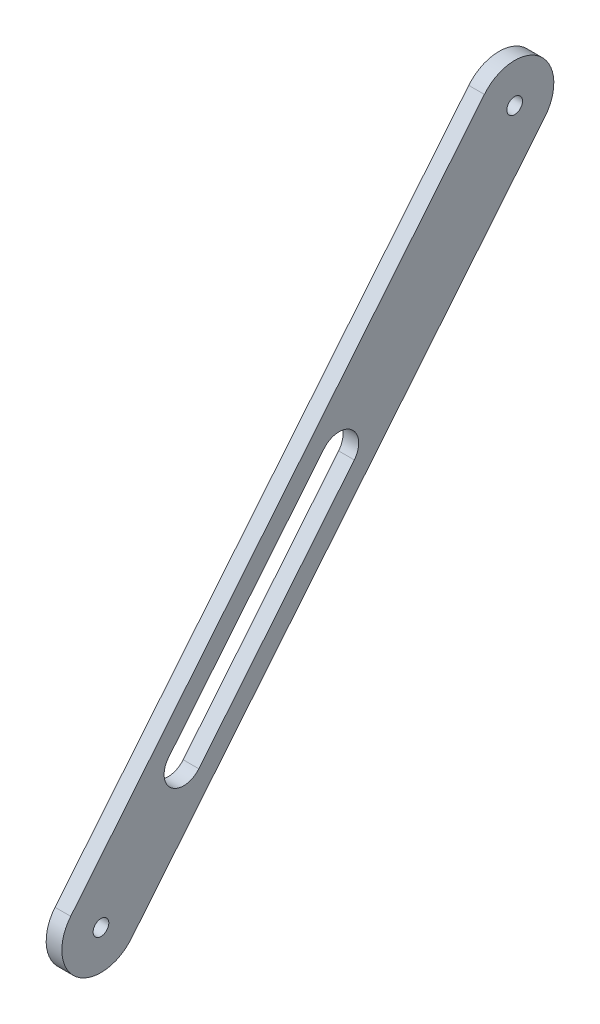
ISO-10303-21;
HEADER;
FILE_DESCRIPTION(('STEP AP214'),'2;1');
FILE_NAME('part.step','',(''),(''),'','','');
FILE_SCHEMA(('AUTOMOTIVE_DESIGN { 1 0 10303 214 1 1 1 1 }'));
ENDSEC;
DATA;
#1=APPLICATION_CONTEXT('core data for automotive mechanical design processes');
#2=APPLICATION_PROTOCOL_DEFINITION('international standard','automotive_design',2000,#1);
#3=PRODUCT_CONTEXT('',#1,'mechanical');
#4=PRODUCT('Part','Part','',(#3));
#5=PRODUCT_RELATED_PRODUCT_CATEGORY('part','',(#4));
#6=PRODUCT_DEFINITION_FORMATION('','',#4);
#7=PRODUCT_DEFINITION_CONTEXT('part definition',#1,'design');
#8=PRODUCT_DEFINITION('design','',#6,#7);
#9=PRODUCT_DEFINITION_SHAPE('','',#8);
#10=(LENGTH_UNIT() NAMED_UNIT(*) SI_UNIT(.MILLI.,.METRE.));
#11=(NAMED_UNIT(*) PLANE_ANGLE_UNIT() SI_UNIT($,.RADIAN.));
#12=(NAMED_UNIT(*) SI_UNIT($,.STERADIAN.) SOLID_ANGLE_UNIT());
#13=UNCERTAINTY_MEASURE_WITH_UNIT(LENGTH_MEASURE(1.E-05),#10,'distance_accuracy_value','');
#14=(GEOMETRIC_REPRESENTATION_CONTEXT(3) GLOBAL_UNCERTAINTY_ASSIGNED_CONTEXT((#13)) GLOBAL_UNIT_ASSIGNED_CONTEXT((#10,
#11,#12)) REPRESENTATION_CONTEXT('',''));
#15=CARTESIAN_POINT('',(0.,0.,0.));
#16=DIRECTION('',(0.,0.,1.));
#17=DIRECTION('',(1.,0.,0.));
#18=AXIS2_PLACEMENT_3D('',#15,#16,#17);
#19=CARTESIAN_POINT('',(-3.99999999999867,21949.5715431067,-17815.443941645));
#20=DIRECTION('',(0.,-0.633762743813113,-0.773527494375264));
#21=DIRECTION('',(0.,0.773527494375265,-0.633762743813113));
#22=AXIS2_PLACEMENT_3D('',#19,#20,#21);
#23=PLANE('',#22);
#24=DIRECTION('',(0.,-0.773527494375265,0.633762743813113));
#25=VECTOR('',#24,1.);
#26=CARTESIAN_POINT('',(-6.99999999999867,21949.5715431067,-17815.443941645));
#27=LINE('',#26,#25);
#28=CARTESIAN_POINT('',(-7.00000000000001,107.394735413521,80.1809781579693));
#29=VERTEX_POINT('',#28);
#30=CARTESIAN_POINT('',(-7.00000000000001,10.6467794213656,159.448037821336));
#31=VERTEX_POINT('',#30);
#32=EDGE_CURVE('E134',#29,#31,#27,.T.);
#33=ORIENTED_EDGE('',*,*,#32,.F.);
#34=DIRECTION('',(-1.,0.,0.));
#35=VECTOR('',#34,1.);
#36=CARTESIAN_POINT('',(-4.00000000000001,107.394735413521,80.1809781579693));
#37=LINE('',#36,#35);
#38=CARTESIAN_POINT('',(-4.00000000000001,107.394735413521,80.1809781579693));
#39=VERTEX_POINT('',#38);
#40=EDGE_CURVE('E11',#39,#29,#37,.T.);
#41=ORIENTED_EDGE('',*,*,#40,.F.);
#42=DIRECTION('',(0.,-0.773527494375265,0.633762743813113));
#43=VECTOR('',#42,1.);
#44=CARTESIAN_POINT('',(-3.99999999999867,21949.5715431067,-17815.443941645));
#45=LINE('',#44,#43);
#46=CARTESIAN_POINT('',(-4.00000000000001,10.6467794213656,159.448037821336));
#47=VERTEX_POINT('',#46);
#48=EDGE_CURVE('E138',#39,#47,#45,.T.);
#49=ORIENTED_EDGE('',*,*,#48,.T.);
#50=DIRECTION('',(-1.,0.,0.));
#51=VECTOR('',#50,1.);
#52=CARTESIAN_POINT('',(-4.00000000000001,10.6467794213656,159.448037821336));
#53=LINE('',#52,#51);
#54=EDGE_CURVE('E151',#47,#31,#53,.T.);
#55=ORIENTED_EDGE('',*,*,#54,.T.);
#56=EDGE_LOOP('',(#33,#41,#49,#55));
#57=FACE_BOUND('',#56,.T.);
#58=ADVANCED_FACE('F33',(#57),#23,.T.);
#59=CARTESIAN_POINT('',(-4.00000000000001,112.147955992155,85.9824343657549));
#60=DIRECTION('',(-1.,0.,0.));
#61=DIRECTION('',(0.,0.,1.));
#62=AXIS2_PLACEMENT_3D('',#59,#60,#61);
#63=CYLINDRICAL_SURFACE('',#62,7.49999999999999);
#64=CARTESIAN_POINT('',(-7.00000000000001,112.147955992155,85.9824343657549));
#65=DIRECTION('',(-1.,0.,0.));
#66=DIRECTION('',(0.,0.,1.));
#67=AXIS2_PLACEMENT_3D('',#64,#65,#66);
#68=CIRCLE('',#67,7.49999999999999);
#69=CARTESIAN_POINT('',(-7.00000000000001,116.901176570709,91.7838905736058));
#70=VERTEX_POINT('',#69);
#71=EDGE_CURVE('E142',#70,#29,#68,.T.);
#72=ORIENTED_EDGE('',*,*,#71,.F.);
#73=DIRECTION('',(-1.,0.,0.));
#74=VECTOR('',#73,1.);
#75=CARTESIAN_POINT('',(-4.00000000000001,116.901176570709,91.7838905736058));
#76=LINE('',#75,#74);
#77=CARTESIAN_POINT('',(-4.00000000000001,116.901176570709,91.7838905736058));
#78=VERTEX_POINT('',#77);
#79=EDGE_CURVE('E41',#78,#70,#76,.T.);
#80=ORIENTED_EDGE('',*,*,#79,.F.);
#81=CARTESIAN_POINT('',(-4.00000000000001,112.147955992155,85.9824343657549));
#82=DIRECTION('',(-1.,0.,0.));
#83=DIRECTION('',(0.,0.,1.));
#84=AXIS2_PLACEMENT_3D('',#81,#82,#83);
#85=CIRCLE('',#84,7.49999999999999);
#86=EDGE_CURVE('E148',#78,#39,#85,.T.);
#87=ORIENTED_EDGE('',*,*,#86,.T.);
#88=ORIENTED_EDGE('',*,*,#40,.T.);
#89=EDGE_LOOP('',(#72,#80,#87,#88));
#90=FACE_BOUND('',#89,.T.);
#91=ADVANCED_FACE('F176',(#90),#63,.T.);
#92=CARTESIAN_POINT('',(-3.99999999999867,21959.077984264,-17803.8410292294));
#93=DIRECTION('',(0.,0.633762743813113,0.773527494375264));
#94=DIRECTION('',(0.,-0.773527494375264,0.633762743813113));
#95=AXIS2_PLACEMENT_3D('',#92,#93,#94);
#96=PLANE('',#95);
#97=DIRECTION('',(0.,0.773527494375264,-0.633762743813113));
#98=VECTOR('',#97,1.);
#99=CARTESIAN_POINT('',(-6.99999999999867,21959.077984264,-17803.8410292294));
#100=LINE('',#99,#98);
#101=CARTESIAN_POINT('',(-7.00000000000001,20.1532205786314,171.050950236992));
#102=VERTEX_POINT('',#101);
#103=EDGE_CURVE('E157',#102,#70,#100,.T.);
#104=ORIENTED_EDGE('',*,*,#103,.F.);
#105=DIRECTION('',(-1.,0.,0.));
#106=VECTOR('',#105,1.);
#107=CARTESIAN_POINT('',(-4.00000000000001,20.1532205786314,171.050950236992));
#108=LINE('',#107,#106);
#109=CARTESIAN_POINT('',(-4.00000000000001,20.1532205786314,171.050950236992));
#110=VERTEX_POINT('',#109);
#111=EDGE_CURVE('E163',#110,#102,#108,.T.);
#112=ORIENTED_EDGE('',*,*,#111,.F.);
#113=DIRECTION('',(0.,0.773527494375264,-0.633762743813113));
#114=VECTOR('',#113,1.);
#115=CARTESIAN_POINT('',(-3.99999999999867,21959.077984264,-17803.8410292294));
#116=LINE('',#115,#114);
#117=EDGE_CURVE('E145',#110,#78,#116,.T.);
#118=ORIENTED_EDGE('',*,*,#117,.T.);
#119=ORIENTED_EDGE('',*,*,#79,.T.);
#120=EDGE_LOOP('',(#104,#112,#118,#119));
#121=FACE_BOUND('',#120,.T.);
#122=ADVANCED_FACE('F180',(#121),#96,.T.);
#123=CARTESIAN_POINT('',(-4.00000000000001,15.4,165.249494029121));
#124=DIRECTION('',(-1.,0.,0.));
#125=DIRECTION('',(0.,0.,1.));
#126=AXIS2_PLACEMENT_3D('',#123,#124,#125);
#127=CYLINDRICAL_SURFACE('',#126,7.50000000000002);
#128=CARTESIAN_POINT('',(-7.00000000000001,15.4,165.249494029121));
#129=DIRECTION('',(-1.,0.,0.));
#130=DIRECTION('',(0.,0.,1.));
#131=AXIS2_PLACEMENT_3D('',#128,#129,#130);
#132=CIRCLE('',#131,7.50000000000002);
#133=EDGE_CURVE('E154',#31,#102,#132,.T.);
#134=ORIENTED_EDGE('',*,*,#133,.F.);
#135=ORIENTED_EDGE('',*,*,#54,.F.);
#136=CARTESIAN_POINT('',(-4.00000000000001,15.4,165.249494029121));
#137=DIRECTION('',(-1.,0.,0.));
#138=DIRECTION('',(0.,0.,1.));
#139=AXIS2_PLACEMENT_3D('',#136,#137,#138);
#140=CIRCLE('',#139,7.50000000000002);
#141=EDGE_CURVE('E141',#47,#110,#140,.T.);
#142=ORIENTED_EDGE('',*,*,#141,.T.);
#143=ORIENTED_EDGE('',*,*,#111,.T.);
#144=EDGE_LOOP('',(#134,#135,#142,#143));
#145=FACE_BOUND('',#144,.T.);
#146=ADVANCED_FACE('F170',(#145),#127,.T.);
#147=CARTESIAN_POINT('',(-4.00000000000001,15.4,165.249494029121));
#148=DIRECTION('',(-1.,0.,0.));
#149=DIRECTION('',(0.,0.,1.));
#150=AXIS2_PLACEMENT_3D('',#147,#148,#149);
#151=PLANE('',#150);
#152=CARTESIAN_POINT('',(-4.00000000000001,112.147955992155,85.9824343657549));
#153=DIRECTION('',(-1.,0.,0.));
#154=DIRECTION('',(0.,0.,1.));
#155=AXIS2_PLACEMENT_3D('',#152,#153,#154);
#156=CIRCLE('',#155,1.49999999999999);
#157=CARTESIAN_POINT('',(-4.00000000000001,112.147955992155,87.4824343657549));
#158=VERTEX_POINT('',#157);
#159=EDGE_CURVE('E36',#158,#158,#156,.T.);
#160=ORIENTED_EDGE('',*,*,#159,.T.);
#161=EDGE_LOOP('',(#160));
#162=FACE_BOUND('',#161,.T.);
#163=CARTESIAN_POINT('',(-4.00000000000001,15.4,165.249494029121));
#164=DIRECTION('',(-1.,0.,0.));
#165=DIRECTION('',(0.,0.,1.));
#166=AXIS2_PLACEMENT_3D('',#163,#164,#165);
#167=CIRCLE('',#166,1.49999999999999);
#168=CARTESIAN_POINT('',(-4.00000000000001,15.4,166.749494029121));
#169=VERTEX_POINT('',#168);
#170=EDGE_CURVE('E122',#169,#169,#167,.T.);
#171=ORIENTED_EDGE('',*,*,#170,.T.);
#172=EDGE_LOOP('',(#171));
#173=FACE_BOUND('',#172,.T.);
#174=CARTESIAN_POINT('',(-4.00000000000001,71.093979595019,119.618576474577));
#175=DIRECTION('',(-1.,0.,0.));
#176=DIRECTION('',(0.,0.,1.));
#177=AXIS2_PLACEMENT_3D('',#174,#175,#176);
#178=CIRCLE('',#177,3.75000000000029);
#179=CARTESIAN_POINT('',(-4.00000000000001,73.470589884327,122.519304578478));
#180=VERTEX_POINT('',#179);
#181=CARTESIAN_POINT('',(-4.00000000000001,68.717369305683,116.7178483707));
#182=VERTEX_POINT('',#181);
#183=EDGE_CURVE('E106',#180,#182,#178,.T.);
#184=ORIENTED_EDGE('',*,*,#183,.T.);
#185=DIRECTION('',(0.,-0.773527494375264,0.633762743813113));
#186=VECTOR('',#185,1.);
#187=CARTESIAN_POINT('',(-3.99999999999867,21951.9481533962,-17812.5432135413));
#188=LINE('',#187,#186);
#189=CARTESIAN_POINT('',(-4.00000000000001,32.3615770700471,146.504697329915));
#190=VERTEX_POINT('',#189);
#191=EDGE_CURVE('E100',#182,#190,#188,.T.);
#192=ORIENTED_EDGE('',*,*,#191,.T.);
#193=CARTESIAN_POINT('',(-4.00000000000001,34.7381873593816,149.405425433794));
#194=DIRECTION('',(-1.,0.,0.));
#195=DIRECTION('',(0.,0.,1.));
#196=AXIS2_PLACEMENT_3D('',#193,#194,#195);
#197=CIRCLE('',#196,3.75000000000032);
#198=CARTESIAN_POINT('',(-4.00000000000001,37.1147976486773,152.306153537704));
#199=VERTEX_POINT('',#198);
#200=EDGE_CURVE('E109',#190,#199,#197,.T.);
#201=ORIENTED_EDGE('',*,*,#200,.T.);
#202=DIRECTION('',(0.,0.773527494375264,-0.633762743813114));
#203=VECTOR('',#202,1.);
#204=CARTESIAN_POINT('',(-3.99999999999867,21956.7013739751,-17806.7417573338));
#205=LINE('',#204,#203);
#206=EDGE_CURVE('E49',#199,#180,#205,.T.);
#207=ORIENTED_EDGE('',*,*,#206,.T.);
#208=EDGE_LOOP('',(#184,#192,#201,#207));
#209=FACE_BOUND('',#208,.T.);
#210=ORIENTED_EDGE('',*,*,#48,.F.);
#211=ORIENTED_EDGE('',*,*,#86,.F.);
#212=ORIENTED_EDGE('',*,*,#117,.F.);
#213=ORIENTED_EDGE('',*,*,#141,.F.);
#214=EDGE_LOOP('',(#210,#211,#212,#213));
#215=FACE_BOUND('',#214,.T.);
#216=ADVANCED_FACE('F113',(#162,#173,#209,#215),#151,.F.);
#217=CARTESIAN_POINT('',(-7.00000000000001,15.4,165.249494029121));
#218=DIRECTION('',(-1.,0.,0.));
#219=DIRECTION('',(0.,0.,1.));
#220=AXIS2_PLACEMENT_3D('',#217,#218,#219);
#221=PLANE('',#220);
#222=CARTESIAN_POINT('',(-7.00000000000001,112.147955992155,85.9824343657549));
#223=DIRECTION('',(1.,0.,0.));
#224=DIRECTION('',(0.,0.,-1.));
#225=AXIS2_PLACEMENT_3D('',#222,#223,#224);
#226=CIRCLE('',#225,1.5);
#227=CARTESIAN_POINT('',(-7.00000000000001,112.147955992155,84.4824343657549));
#228=VERTEX_POINT('',#227);
#229=EDGE_CURVE('E285',#228,#228,#226,.T.);
#230=ORIENTED_EDGE('',*,*,#229,.T.);
#231=EDGE_LOOP('',(#230));
#232=FACE_BOUND('',#231,.T.);
#233=CARTESIAN_POINT('',(-7.00000000000002,15.4,165.249494029121));
#234=DIRECTION('',(1.,0.,0.));
#235=DIRECTION('',(0.,0.,-1.));
#236=AXIS2_PLACEMENT_3D('',#233,#234,#235);
#237=CIRCLE('',#236,1.5);
#238=CARTESIAN_POINT('',(-7.00000000000002,15.4,163.749494029121));
#239=VERTEX_POINT('',#238);
#240=EDGE_CURVE('E288',#239,#239,#237,.T.);
#241=ORIENTED_EDGE('',*,*,#240,.T.);
#242=EDGE_LOOP('',(#241));
#243=FACE_BOUND('',#242,.T.);
#244=DIRECTION('',(0.,-0.773527494375264,0.633762743813113));
#245=VECTOR('',#244,1.);
#246=CARTESIAN_POINT('',(-6.99999999999867,21951.9481533962,-17812.5432135413));
#247=LINE('',#246,#245);
#248=CARTESIAN_POINT('',(-7.00000000000001,68.717369305683,116.7178483707));
#249=VERTEX_POINT('',#248);
#250=CARTESIAN_POINT('',(-7.00000000000001,32.3615770700471,146.504697329915));
#251=VERTEX_POINT('',#250);
#252=EDGE_CURVE('E57',#249,#251,#247,.T.);
#253=ORIENTED_EDGE('',*,*,#252,.F.);
#254=CARTESIAN_POINT('',(-7.00000000000001,71.093979595019,119.618576474577));
#255=DIRECTION('',(-1.,0.,0.));
#256=DIRECTION('',(0.,0.,1.));
#257=AXIS2_PLACEMENT_3D('',#254,#255,#256);
#258=CIRCLE('',#257,3.75000000000029);
#259=CARTESIAN_POINT('',(-7.00000000000001,73.470589884327,122.519304578478));
#260=VERTEX_POINT('',#259);
#261=EDGE_CURVE('E116',#260,#249,#258,.T.);
#262=ORIENTED_EDGE('',*,*,#261,.F.);
#263=DIRECTION('',(0.,0.773527494375264,-0.633762743813114));
#264=VECTOR('',#263,1.);
#265=CARTESIAN_POINT('',(-6.99999999999867,21956.7013739751,-17806.7417573338));
#266=LINE('',#265,#264);
#267=CARTESIAN_POINT('',(-7.00000000000001,37.1147976486661,152.30615353769));
#268=VERTEX_POINT('',#267);
#269=EDGE_CURVE('E119',#268,#260,#266,.T.);
#270=ORIENTED_EDGE('',*,*,#269,.F.);
#271=CARTESIAN_POINT('',(-7.00000000000001,34.7381873593816,149.405425433794));
#272=DIRECTION('',(-1.,0.,0.));
#273=DIRECTION('',(0.,0.,1.));
#274=AXIS2_PLACEMENT_3D('',#271,#272,#273);
#275=CIRCLE('',#274,3.75000000000032);
#276=EDGE_CURVE('E128',#251,#268,#275,.T.);
#277=ORIENTED_EDGE('',*,*,#276,.F.);
#278=EDGE_LOOP('',(#253,#262,#270,#277));
#279=FACE_BOUND('',#278,.T.);
#280=ORIENTED_EDGE('',*,*,#32,.T.);
#281=ORIENTED_EDGE('',*,*,#133,.T.);
#282=ORIENTED_EDGE('',*,*,#103,.T.);
#283=ORIENTED_EDGE('',*,*,#71,.T.);
#284=EDGE_LOOP('',(#280,#281,#282,#283));
#285=FACE_BOUND('',#284,.T.);
#286=ADVANCED_FACE('F173',(#232,#243,#279,#285),#221,.T.);
#287=CARTESIAN_POINT('',(-3.99999999999867,21951.9481533962,-17812.5432135413));
#288=DIRECTION('',(0.,-0.633762743813113,-0.773527494375264));
#289=DIRECTION('',(0.,0.773527494375264,-0.633762743813113));
#290=AXIS2_PLACEMENT_3D('',#287,#288,#289);
#291=PLANE('',#290);
#292=ORIENTED_EDGE('',*,*,#252,.T.);
#293=DIRECTION('',(-1.,0.,0.));
#294=VECTOR('',#293,1.);
#295=CARTESIAN_POINT('',(-4.00000000000001,32.3615770700471,146.504697329915));
#296=LINE('',#295,#294);
#297=EDGE_CURVE('E96',#190,#251,#296,.T.);
#298=ORIENTED_EDGE('',*,*,#297,.F.);
#299=ORIENTED_EDGE('',*,*,#191,.F.);
#300=DIRECTION('',(-1.,0.,0.));
#301=VECTOR('',#300,1.);
#302=CARTESIAN_POINT('',(-4.00000000000001,68.717369305683,116.7178483707));
#303=LINE('',#302,#301);
#304=EDGE_CURVE('E132',#182,#249,#303,.T.);
#305=ORIENTED_EDGE('',*,*,#304,.T.);
#306=EDGE_LOOP('',(#292,#298,#299,#305));
#307=FACE_BOUND('',#306,.T.);
#308=ADVANCED_FACE('F98',(#307),#291,.F.);
#309=CARTESIAN_POINT('',(-4.00000000000001,71.093979595019,119.618576474577));
#310=DIRECTION('',(-1.,0.,0.));
#311=DIRECTION('',(0.,0.,1.));
#312=AXIS2_PLACEMENT_3D('',#309,#310,#311);
#313=CYLINDRICAL_SURFACE('',#312,3.75000000000029);
#314=ORIENTED_EDGE('',*,*,#261,.T.);
#315=ORIENTED_EDGE('',*,*,#304,.F.);
#316=ORIENTED_EDGE('',*,*,#183,.F.);
#317=DIRECTION('',(-1.,0.,0.));
#318=VECTOR('',#317,1.);
#319=CARTESIAN_POINT('',(-4.00000000000001,73.470589884327,122.519304578478));
#320=LINE('',#319,#318);
#321=EDGE_CURVE('E135',#180,#260,#320,.T.);
#322=ORIENTED_EDGE('',*,*,#321,.T.);
#323=EDGE_LOOP('',(#314,#315,#316,#322));
#324=FACE_BOUND('',#323,.T.);
#325=ADVANCED_FACE('F216',(#324),#313,.F.);
#326=CARTESIAN_POINT('',(-3.99999999999867,21956.7013739751,-17806.7417573338));
#327=DIRECTION('',(0.,0.633762743813114,0.773527494375263));
#328=DIRECTION('',(0.,-0.773527494375263,0.633762743813114));
#329=AXIS2_PLACEMENT_3D('',#326,#327,#328);
#330=PLANE('',#329);
#331=ORIENTED_EDGE('',*,*,#269,.T.);
#332=ORIENTED_EDGE('',*,*,#321,.F.);
#333=ORIENTED_EDGE('',*,*,#206,.F.);
#334=DIRECTION('',(-1.,0.,0.));
#335=VECTOR('',#334,1.);
#336=CARTESIAN_POINT('',(-4.00000000000001,37.1147976486661,152.30615353769));
#337=LINE('',#336,#335);
#338=EDGE_CURVE('E105',#199,#268,#337,.T.);
#339=ORIENTED_EDGE('',*,*,#338,.T.);
#340=EDGE_LOOP('',(#331,#332,#333,#339));
#341=FACE_BOUND('',#340,.T.);
#342=ADVANCED_FACE('F227',(#341),#330,.F.);
#343=CARTESIAN_POINT('',(-4.00000000000001,34.7381873593816,149.405425433794));
#344=DIRECTION('',(-1.,0.,0.));
#345=DIRECTION('',(0.,0.,1.));
#346=AXIS2_PLACEMENT_3D('',#343,#344,#345);
#347=CYLINDRICAL_SURFACE('',#346,3.75000000000032);
#348=ORIENTED_EDGE('',*,*,#276,.T.);
#349=ORIENTED_EDGE('',*,*,#338,.F.);
#350=ORIENTED_EDGE('',*,*,#200,.F.);
#351=ORIENTED_EDGE('',*,*,#297,.T.);
#352=EDGE_LOOP('',(#348,#349,#350,#351));
#353=FACE_BOUND('',#352,.T.);
#354=ADVANCED_FACE('F110',(#353),#347,.F.);
#355=CARTESIAN_POINT('',(0.,15.4,165.249494029121));
#356=DIRECTION('',(1.,0.,0.));
#357=DIRECTION('',(0.,0.,-1.));
#358=AXIS2_PLACEMENT_3D('',#355,#356,#357);
#359=CYLINDRICAL_SURFACE('',#358,1.49999999999999);
#360=ORIENTED_EDGE('',*,*,#240,.F.);
#361=EDGE_LOOP('',(#360));
#362=FACE_BOUND('',#361,.T.);
#363=ORIENTED_EDGE('',*,*,#170,.F.);
#364=EDGE_LOOP('',(#363));
#365=FACE_BOUND('',#364,.T.);
#366=ADVANCED_FACE('F245',(#362,#365),#359,.F.);
#367=CARTESIAN_POINT('',(0.,112.147955992155,85.9824343657549));
#368=DIRECTION('',(1.,0.,0.));
#369=DIRECTION('',(0.,0.,-1.));
#370=AXIS2_PLACEMENT_3D('',#367,#368,#369);
#371=CYLINDRICAL_SURFACE('',#370,1.49999999999999);
#372=ORIENTED_EDGE('',*,*,#229,.F.);
#373=EDGE_LOOP('',(#372));
#374=FACE_BOUND('',#373,.T.);
#375=ORIENTED_EDGE('',*,*,#159,.F.);
#376=EDGE_LOOP('',(#375));
#377=FACE_BOUND('',#376,.T.);
#378=ADVANCED_FACE('F268',(#374,#377),#371,.F.);
#379=CLOSED_SHELL('',(#58,#91,#122,#146,#216,#286,#308,#325,#342,#354,#366,#378));
#380=MANIFOLD_SOLID_BREP('B2',#379);
#381=ADVANCED_BREP_SHAPE_REPRESENTATION('',(#18,#380),#14);
#382=SHAPE_DEFINITION_REPRESENTATION(#9,#381);
ENDSEC;
END-ISO-10303-21;
